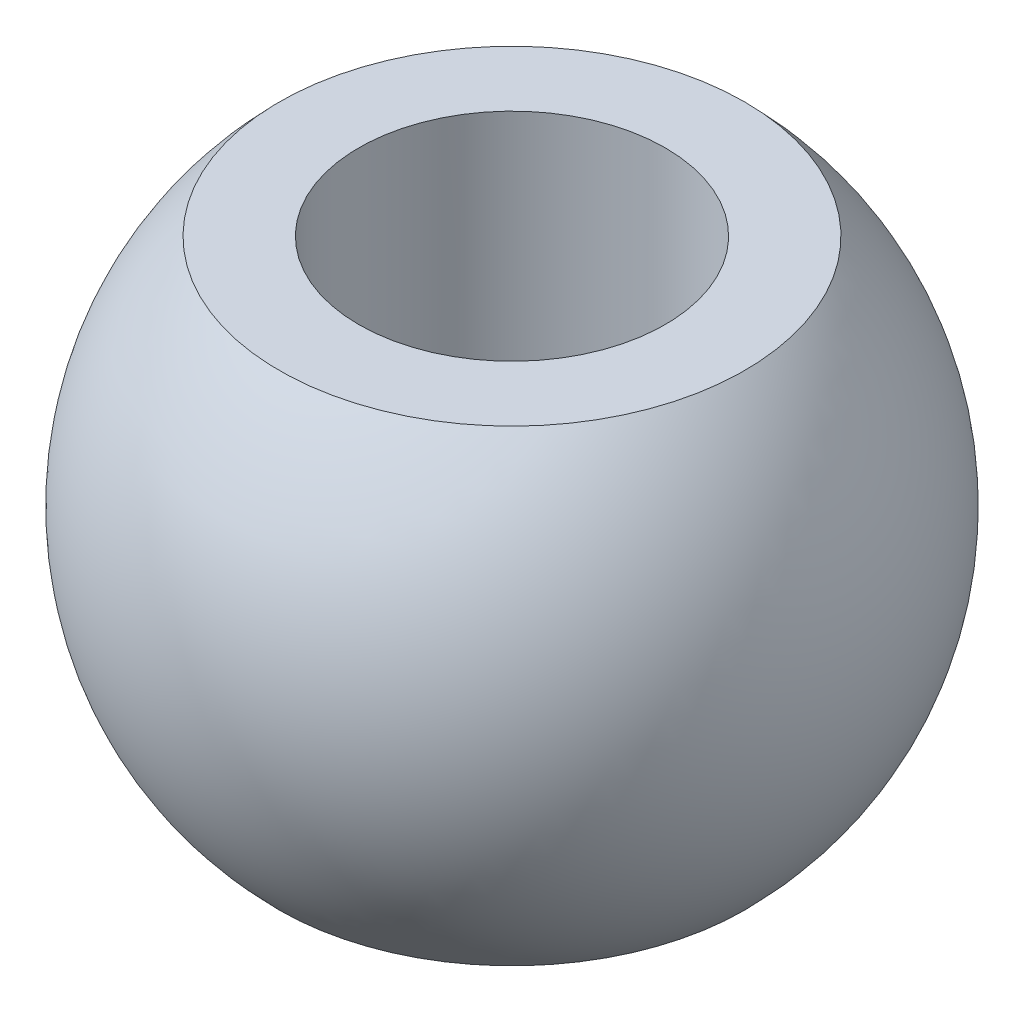
ISO-10303-21;
HEADER;
FILE_DESCRIPTION(('STEP AP214'),'2;1');
FILE_NAME('part.step','',(''),(''),'','','');
FILE_SCHEMA(('AUTOMOTIVE_DESIGN { 1 0 10303 214 1 1 1 1 }'));
ENDSEC;
DATA;
#1=APPLICATION_CONTEXT('core data for automotive mechanical design processes');
#2=APPLICATION_PROTOCOL_DEFINITION('international standard','automotive_design',2000,#1);
#3=PRODUCT_CONTEXT('',#1,'mechanical');
#4=PRODUCT('Part','Part','',(#3));
#5=PRODUCT_RELATED_PRODUCT_CATEGORY('part','',(#4));
#6=PRODUCT_DEFINITION_FORMATION('','',#4);
#7=PRODUCT_DEFINITION_CONTEXT('part definition',#1,'design');
#8=PRODUCT_DEFINITION('design','',#6,#7);
#9=PRODUCT_DEFINITION_SHAPE('','',#8);
#10=(LENGTH_UNIT() NAMED_UNIT(*) SI_UNIT(.MILLI.,.METRE.));
#11=(NAMED_UNIT(*) PLANE_ANGLE_UNIT() SI_UNIT($,.RADIAN.));
#12=(NAMED_UNIT(*) SI_UNIT($,.STERADIAN.) SOLID_ANGLE_UNIT());
#13=UNCERTAINTY_MEASURE_WITH_UNIT(LENGTH_MEASURE(1.E-05),#10,'distance_accuracy_value','');
#14=(GEOMETRIC_REPRESENTATION_CONTEXT(3) GLOBAL_UNCERTAINTY_ASSIGNED_CONTEXT((#13)) GLOBAL_UNIT_ASSIGNED_CONTEXT((#10,
#11,#12)) REPRESENTATION_CONTEXT('',''));
#15=CARTESIAN_POINT('',(0.,0.,0.));
#16=DIRECTION('',(0.,0.,1.));
#17=DIRECTION('',(1.,0.,0.));
#18=AXIS2_PLACEMENT_3D('',#15,#16,#17);
#19=CARTESIAN_POINT('',(0.,-6.35,0.));
#20=DIRECTION('',(0.,1.,0.));
#21=DIRECTION('',(0.,0.,1.));
#22=AXIS2_PLACEMENT_3D('',#19,#20,#21);
#23=CYLINDRICAL_SURFACE('',#22,2.95);
#24=CARTESIAN_POINT('',(0.,4.5,0.));
#25=DIRECTION('',(0.,-1.,0.));
#26=DIRECTION('',(0.,0.,-1.));
#27=AXIS2_PLACEMENT_3D('',#24,#25,#26);
#28=CIRCLE('',#27,2.95);
#29=CARTESIAN_POINT('',(0.,4.5,-2.95));
#30=VERTEX_POINT('',#29);
#31=EDGE_CURVE('E37',#30,#30,#28,.F.);
#32=ORIENTED_EDGE('',*,*,#31,.T.);
#33=EDGE_LOOP('',(#32));
#34=FACE_BOUND('',#33,.T.);
#35=CARTESIAN_POINT('',(0.,-4.5,0.));
#36=DIRECTION('',(0.,1.,0.));
#37=DIRECTION('',(0.,0.,1.));
#38=AXIS2_PLACEMENT_3D('',#35,#36,#37);
#39=CIRCLE('',#38,2.95);
#40=CARTESIAN_POINT('',(0.,-4.5,2.95));
#41=VERTEX_POINT('',#40);
#42=EDGE_CURVE('E47',#41,#41,#39,.F.);
#43=ORIENTED_EDGE('',*,*,#42,.T.);
#44=EDGE_LOOP('',(#43));
#45=FACE_BOUND('',#44,.T.);
#46=ADVANCED_FACE('F33',(#34,#45),#23,.F.);
#47=CARTESIAN_POINT('',(-4.48023436886956,-4.5,-6.35));
#48=DIRECTION('',(0.,1.,0.));
#49=DIRECTION('',(0.,0.,1.));
#50=AXIS2_PLACEMENT_3D('',#47,#48,#49);
#51=PLANE('',#50);
#52=ORIENTED_EDGE('',*,*,#42,.F.);
#53=EDGE_LOOP('',(#52));
#54=FACE_BOUND('',#53,.T.);
#55=CARTESIAN_POINT('',(0.,-4.5,0.));
#56=DIRECTION('',(0.,1.,0.));
#57=DIRECTION('',(0.,0.,1.));
#58=AXIS2_PLACEMENT_3D('',#55,#56,#57);
#59=CIRCLE('',#58,4.48023436886956);
#60=CARTESIAN_POINT('',(0.,-4.5,4.48023436886956));
#61=VERTEX_POINT('',#60);
#62=EDGE_CURVE('E45',#61,#61,#59,.T.);
#63=ORIENTED_EDGE('',*,*,#62,.F.);
#64=EDGE_LOOP('',(#63));
#65=FACE_BOUND('',#64,.T.);
#66=ADVANCED_FACE('F55',(#54,#65),#51,.F.);
#67=CARTESIAN_POINT('',(-4.48023436886956,4.5,-6.35));
#68=DIRECTION('',(0.,-1.,0.));
#69=DIRECTION('',(0.,0.,-1.));
#70=AXIS2_PLACEMENT_3D('',#67,#68,#69);
#71=PLANE('',#70);
#72=ORIENTED_EDGE('',*,*,#31,.F.);
#73=EDGE_LOOP('',(#72));
#74=FACE_BOUND('',#73,.T.);
#75=CARTESIAN_POINT('',(0.,4.5,0.));
#76=DIRECTION('',(0.,-1.,0.));
#77=DIRECTION('',(0.,0.,-1.));
#78=AXIS2_PLACEMENT_3D('',#75,#76,#77);
#79=CIRCLE('',#78,4.48023436886956);
#80=CARTESIAN_POINT('',(0.,4.5,-4.48023436886956));
#81=VERTEX_POINT('',#80);
#82=EDGE_CURVE('E10',#81,#81,#79,.T.);
#83=ORIENTED_EDGE('',*,*,#82,.F.);
#84=EDGE_LOOP('',(#83));
#85=FACE_BOUND('',#84,.T.);
#86=ADVANCED_FACE('F57',(#74,#85),#71,.F.);
#87=CARTESIAN_POINT('',(0.,0.,0.));
#88=DIRECTION('',(0.,0.,-1.));
#89=DIRECTION('',(1.,0.,0.));
#90=AXIS2_PLACEMENT_3D('',#87,#88,#89);
#91=SPHERICAL_SURFACE('',#90,6.35);
#92=CARTESIAN_POINT('',(0.,0.,0.));
#93=DIRECTION('',(0.,-1.,0.));
#94=DIRECTION('',(0.,0.,-1.));
#95=AXIS2_PLACEMENT_3D('',#92,#93,#94);
#96=SPHERICAL_SURFACE('',#95,6.35);
#97=ORIENTED_EDGE('',*,*,#82,.T.);
#98=EDGE_LOOP('',(#97));
#99=FACE_BOUND('',#98,.T.);
#100=ORIENTED_EDGE('',*,*,#62,.T.);
#101=EDGE_LOOP('',(#100));
#102=FACE_BOUND('',#101,.T.);
#103=ADVANCED_FACE('F35',(#99,#102),#96,.T.);
#104=CLOSED_SHELL('',(#46,#66,#86,#103));
#105=MANIFOLD_SOLID_BREP('B2',#104);
#106=ADVANCED_BREP_SHAPE_REPRESENTATION('',(#18,#105),#14);
#107=SHAPE_DEFINITION_REPRESENTATION(#9,#106);
ENDSEC;
END-ISO-10303-21;
